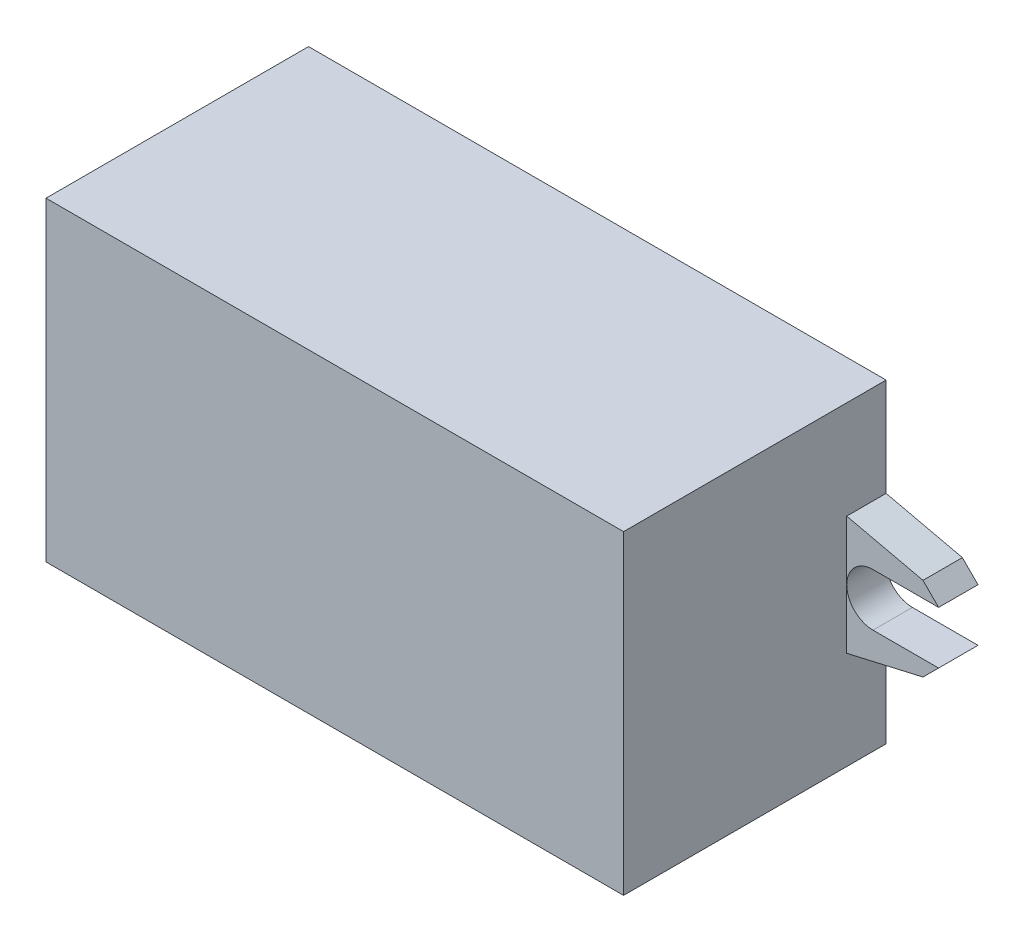
ISO-10303-21;
HEADER;
FILE_DESCRIPTION(('STEP AP214'),'2;1');
FILE_NAME('part.step','',(''),(''),'','','');
FILE_SCHEMA(('AUTOMOTIVE_DESIGN { 1 0 10303 214 1 1 1 1 }'));
ENDSEC;
DATA;
#1=APPLICATION_CONTEXT('core data for automotive mechanical design processes');
#2=APPLICATION_PROTOCOL_DEFINITION('international standard','automotive_design',2000,#1);
#3=PRODUCT_CONTEXT('',#1,'mechanical');
#4=PRODUCT('Part','Part','',(#3));
#5=PRODUCT_RELATED_PRODUCT_CATEGORY('part','',(#4));
#6=PRODUCT_DEFINITION_FORMATION('','',#4);
#7=PRODUCT_DEFINITION_CONTEXT('part definition',#1,'design');
#8=PRODUCT_DEFINITION('design','',#6,#7);
#9=PRODUCT_DEFINITION_SHAPE('','',#8);
#10=(LENGTH_UNIT() NAMED_UNIT(*) SI_UNIT(.MILLI.,.METRE.));
#11=(NAMED_UNIT(*) PLANE_ANGLE_UNIT() SI_UNIT($,.RADIAN.));
#12=(NAMED_UNIT(*) SI_UNIT($,.STERADIAN.) SOLID_ANGLE_UNIT());
#13=UNCERTAINTY_MEASURE_WITH_UNIT(LENGTH_MEASURE(1.E-05),#10,'distance_accuracy_value','');
#14=(GEOMETRIC_REPRESENTATION_CONTEXT(3) GLOBAL_UNCERTAINTY_ASSIGNED_CONTEXT((#13)) GLOBAL_UNIT_ASSIGNED_CONTEXT((#10,
#11,#12)) REPRESENTATION_CONTEXT('',''));
#15=CARTESIAN_POINT('',(0.,0.,0.));
#16=DIRECTION('',(0.,0.,1.));
#17=DIRECTION('',(1.,0.,0.));
#18=AXIS2_PLACEMENT_3D('',#15,#16,#17);
#19=CARTESIAN_POINT('',(22.,-12.,20.));
#20=DIRECTION('',(-1.,0.,0.));
#21=DIRECTION('',(0.,-1.,0.));
#22=AXIS2_PLACEMENT_3D('',#19,#20,#21);
#23=PLANE('',#22);
#24=DIRECTION('',(0.,1.,0.));
#25=VECTOR('',#24,1.);
#26=CARTESIAN_POINT('',(22.,-12.,0.));
#27=LINE('',#26,#25);
#28=CARTESIAN_POINT('',(22.,-12.,0.));
#29=VERTEX_POINT('',#28);
#30=CARTESIAN_POINT('',(22.,-4.52363981943461,0.));
#31=VERTEX_POINT('',#30);
#32=EDGE_CURVE('E238',#29,#31,#27,.T.);
#33=ORIENTED_EDGE('',*,*,#32,.T.);
#34=DIRECTION('',(0.,0.,-1.));
#35=VECTOR('',#34,1.);
#36=CARTESIAN_POINT('',(22.,-4.52363981943461,3.));
#37=LINE('',#36,#35);
#38=CARTESIAN_POINT('',(22.,-4.52363981943461,3.));
#39=VERTEX_POINT('',#38);
#40=EDGE_CURVE('E222',#39,#31,#37,.T.);
#41=ORIENTED_EDGE('',*,*,#40,.F.);
#42=DIRECTION('',(0.,-1.,0.));
#43=VECTOR('',#42,1.);
#44=CARTESIAN_POINT('',(22.,0.,3.));
#45=LINE('',#44,#43);
#46=CARTESIAN_POINT('',(22.,0.,3.));
#47=VERTEX_POINT('',#46);
#48=EDGE_CURVE('E474',#47,#39,#45,.T.);
#49=ORIENTED_EDGE('',*,*,#48,.F.);
#50=DIRECTION('',(0.,-1.,0.));
#51=VECTOR('',#50,1.);
#52=CARTESIAN_POINT('',(22.,0.,3.));
#53=LINE('',#52,#51);
#54=CARTESIAN_POINT('',(22.,4.52363981943461,3.));
#55=VERTEX_POINT('',#54);
#56=EDGE_CURVE('E91',#55,#47,#53,.T.);
#57=ORIENTED_EDGE('',*,*,#56,.F.);
#58=DIRECTION('',(0.,0.,-1.));
#59=VECTOR('',#58,1.);
#60=CARTESIAN_POINT('',(22.,4.52363981943461,3.));
#61=LINE('',#60,#59);
#62=CARTESIAN_POINT('',(22.,4.52363981943461,0.));
#63=VERTEX_POINT('',#62);
#64=EDGE_CURVE('E430',#55,#63,#61,.T.);
#65=ORIENTED_EDGE('',*,*,#64,.T.);
#66=CARTESIAN_POINT('',(22.,12.,0.));
#67=VERTEX_POINT('',#66);
#68=EDGE_CURVE('E250',#63,#67,#27,.T.);
#69=ORIENTED_EDGE('',*,*,#68,.T.);
#70=DIRECTION('',(0.,0.,-1.));
#71=VECTOR('',#70,1.);
#72=CARTESIAN_POINT('',(22.,12.,20.));
#73=LINE('',#72,#71);
#74=CARTESIAN_POINT('',(22.,12.,20.));
#75=VERTEX_POINT('',#74);
#76=EDGE_CURVE('E264',#75,#67,#73,.T.);
#77=ORIENTED_EDGE('',*,*,#76,.F.);
#78=DIRECTION('',(0.,1.,0.));
#79=VECTOR('',#78,1.);
#80=CARTESIAN_POINT('',(22.,-12.,20.));
#81=LINE('',#80,#79);
#82=CARTESIAN_POINT('',(22.,-12.,20.));
#83=VERTEX_POINT('',#82);
#84=EDGE_CURVE('E271',#83,#75,#81,.T.);
#85=ORIENTED_EDGE('',*,*,#84,.F.);
#86=DIRECTION('',(0.,0.,-1.));
#87=VECTOR('',#86,1.);
#88=CARTESIAN_POINT('',(22.,-12.,20.));
#89=LINE('',#88,#87);
#90=EDGE_CURVE('E84',#83,#29,#89,.T.);
#91=ORIENTED_EDGE('',*,*,#90,.T.);
#92=EDGE_LOOP('',(#33,#41,#49,#57,#65,#69,#77,#85,#91));
#93=FACE_BOUND('',#92,.T.);
#94=ADVANCED_FACE('F75',(#93),#23,.F.);
#95=CARTESIAN_POINT('',(-22.,-12.,20.));
#96=DIRECTION('',(1.,0.,0.));
#97=DIRECTION('',(0.,0.,-1.));
#98=AXIS2_PLACEMENT_3D('',#95,#96,#97);
#99=PLANE('',#98);
#100=DIRECTION('',(0.,0.,-1.));
#101=VECTOR('',#100,1.);
#102=CARTESIAN_POINT('',(-22.,-4.52363981943462,3.));
#103=LINE('',#102,#101);
#104=CARTESIAN_POINT('',(-22.,-4.52363981943462,3.));
#105=VERTEX_POINT('',#104);
#106=CARTESIAN_POINT('',(-22.,-4.52363981943462,0.));
#107=VERTEX_POINT('',#106);
#108=EDGE_CURVE('E393',#105,#107,#103,.T.);
#109=ORIENTED_EDGE('',*,*,#108,.T.);
#110=DIRECTION('',(0.,-1.,0.));
#111=VECTOR('',#110,1.);
#112=CARTESIAN_POINT('',(-22.,-12.,0.));
#113=LINE('',#112,#111);
#114=CARTESIAN_POINT('',(-22.,-12.,0.));
#115=VERTEX_POINT('',#114);
#116=EDGE_CURVE('E288',#107,#115,#113,.T.);
#117=ORIENTED_EDGE('',*,*,#116,.T.);
#118=DIRECTION('',(0.,0.,-1.));
#119=VECTOR('',#118,1.);
#120=CARTESIAN_POINT('',(-22.,-12.,20.));
#121=LINE('',#120,#119);
#122=CARTESIAN_POINT('',(-22.,-12.,20.));
#123=VERTEX_POINT('',#122);
#124=EDGE_CURVE('E12',#123,#115,#121,.T.);
#125=ORIENTED_EDGE('',*,*,#124,.F.);
#126=DIRECTION('',(0.,-1.,0.));
#127=VECTOR('',#126,1.);
#128=CARTESIAN_POINT('',(-22.,-12.,20.));
#129=LINE('',#128,#127);
#130=CARTESIAN_POINT('',(-22.,12.,20.));
#131=VERTEX_POINT('',#130);
#132=EDGE_CURVE('E254',#131,#123,#129,.T.);
#133=ORIENTED_EDGE('',*,*,#132,.F.);
#134=DIRECTION('',(0.,0.,-1.));
#135=VECTOR('',#134,1.);
#136=CARTESIAN_POINT('',(-22.,12.,20.));
#137=LINE('',#136,#135);
#138=CARTESIAN_POINT('',(-22.,12.,0.));
#139=VERTEX_POINT('',#138);
#140=EDGE_CURVE('E260',#131,#139,#137,.T.);
#141=ORIENTED_EDGE('',*,*,#140,.T.);
#142=CARTESIAN_POINT('',(-22.,4.52363981943461,0.));
#143=VERTEX_POINT('',#142);
#144=EDGE_CURVE('E286',#139,#143,#113,.T.);
#145=ORIENTED_EDGE('',*,*,#144,.T.);
#146=DIRECTION('',(0.,0.,-1.));
#147=VECTOR('',#146,1.);
#148=CARTESIAN_POINT('',(-22.,4.52363981943461,3.));
#149=LINE('',#148,#147);
#150=CARTESIAN_POINT('',(-22.,4.52363981943461,3.));
#151=VERTEX_POINT('',#150);
#152=EDGE_CURVE('E292',#151,#143,#149,.T.);
#153=ORIENTED_EDGE('',*,*,#152,.F.);
#154=DIRECTION('',(0.,1.,0.));
#155=VECTOR('',#154,1.);
#156=CARTESIAN_POINT('',(-22.,0.,3.));
#157=LINE('',#156,#155);
#158=CARTESIAN_POINT('',(-22.,0.,3.));
#159=VERTEX_POINT('',#158);
#160=EDGE_CURVE('E313',#159,#151,#157,.T.);
#161=ORIENTED_EDGE('',*,*,#160,.F.);
#162=DIRECTION('',(0.,1.,0.));
#163=VECTOR('',#162,1.);
#164=CARTESIAN_POINT('',(-22.,0.,3.));
#165=LINE('',#164,#163);
#166=EDGE_CURVE('E99',#105,#159,#165,.T.);
#167=ORIENTED_EDGE('',*,*,#166,.F.);
#168=EDGE_LOOP('',(#109,#117,#125,#133,#141,#145,#153,#161,#167));
#169=FACE_BOUND('',#168,.T.);
#170=ADVANCED_FACE('F77',(#169),#99,.F.);
#171=CARTESIAN_POINT('',(22.,-12.,20.));
#172=DIRECTION('',(0.,1.,0.));
#173=DIRECTION('',(-1.,0.,0.));
#174=AXIS2_PLACEMENT_3D('',#171,#172,#173);
#175=PLANE('',#174);
#176=DIRECTION('',(1.,0.,0.));
#177=VECTOR('',#176,1.);
#178=CARTESIAN_POINT('',(22.,-12.,0.));
#179=LINE('',#178,#177);
#180=EDGE_CURVE('E256',#115,#29,#179,.T.);
#181=ORIENTED_EDGE('',*,*,#180,.T.);
#182=ORIENTED_EDGE('',*,*,#90,.F.);
#183=DIRECTION('',(1.,0.,0.));
#184=VECTOR('',#183,1.);
#185=CARTESIAN_POINT('',(22.,-12.,20.));
#186=LINE('',#185,#184);
#187=EDGE_CURVE('E274',#123,#83,#186,.T.);
#188=ORIENTED_EDGE('',*,*,#187,.F.);
#189=ORIENTED_EDGE('',*,*,#124,.T.);
#190=EDGE_LOOP('',(#181,#182,#188,#189));
#191=FACE_BOUND('',#190,.T.);
#192=ADVANCED_FACE('F373',(#191),#175,.F.);
#193=CARTESIAN_POINT('',(22.,12.,20.));
#194=DIRECTION('',(0.,-1.,0.));
#195=DIRECTION('',(1.,0.,0.));
#196=AXIS2_PLACEMENT_3D('',#193,#194,#195);
#197=PLANE('',#196);
#198=DIRECTION('',(-1.,0.,0.));
#199=VECTOR('',#198,1.);
#200=CARTESIAN_POINT('',(22.,12.,0.));
#201=LINE('',#200,#199);
#202=EDGE_CURVE('E249',#67,#139,#201,.T.);
#203=ORIENTED_EDGE('',*,*,#202,.T.);
#204=ORIENTED_EDGE('',*,*,#140,.F.);
#205=DIRECTION('',(-1.,0.,0.));
#206=VECTOR('',#205,1.);
#207=CARTESIAN_POINT('',(22.,12.,20.));
#208=LINE('',#207,#206);
#209=EDGE_CURVE('E265',#75,#131,#208,.T.);
#210=ORIENTED_EDGE('',*,*,#209,.F.);
#211=ORIENTED_EDGE('',*,*,#76,.T.);
#212=EDGE_LOOP('',(#203,#204,#210,#211));
#213=FACE_BOUND('',#212,.T.);
#214=ADVANCED_FACE('F375',(#213),#197,.F.);
#215=CARTESIAN_POINT('',(0.,0.,20.));
#216=DIRECTION('',(0.,0.,1.));
#217=DIRECTION('',(1.,0.,0.));
#218=AXIS2_PLACEMENT_3D('',#215,#216,#217);
#219=PLANE('',#218);
#220=ORIENTED_EDGE('',*,*,#132,.T.);
#221=ORIENTED_EDGE('',*,*,#187,.T.);
#222=ORIENTED_EDGE('',*,*,#84,.T.);
#223=ORIENTED_EDGE('',*,*,#209,.T.);
#224=EDGE_LOOP('',(#220,#221,#222,#223));
#225=FACE_BOUND('',#224,.T.);
#226=ADVANCED_FACE('F382',(#225),#219,.T.);
#227=CARTESIAN_POINT('',(0.,0.,0.));
#228=DIRECTION('',(0.,0.,1.));
#229=DIRECTION('',(1.,0.,0.));
#230=AXIS2_PLACEMENT_3D('',#227,#228,#229);
#231=PLANE('',#230);
#232=ORIENTED_EDGE('',*,*,#144,.F.);
#233=ORIENTED_EDGE('',*,*,#202,.F.);
#234=ORIENTED_EDGE('',*,*,#68,.F.);
#235=DIRECTION('',(-0.974674445375651,0.223628543642503,0.));
#236=VECTOR('',#235,1.);
#237=CARTESIAN_POINT('',(2.08620923592413,9.09264442204883,0.));
#238=LINE('',#237,#236);
#239=CARTESIAN_POINT('',(27.8092239984613,3.19077600153869,0.));
#240=VERTEX_POINT('',#239);
#241=EDGE_CURVE('E451',#240,#63,#238,.T.);
#242=ORIENTED_EDGE('',*,*,#241,.F.);
#243=DIRECTION('',(-0.707106781186546,0.707106781186549,0.));
#244=VECTOR('',#243,1.);
#245=CARTESIAN_POINT('',(15.5000000000001,15.5,0.));
#246=LINE('',#245,#244);
#247=CARTESIAN_POINT('',(29.,1.99999999999999,0.));
#248=VERTEX_POINT('',#247);
#249=EDGE_CURVE('E448',#248,#240,#246,.T.);
#250=ORIENTED_EDGE('',*,*,#249,.F.);
#251=DIRECTION('',(-1.,0.,0.));
#252=VECTOR('',#251,1.);
#253=CARTESIAN_POINT('',(0.,2.,0.));
#254=LINE('',#253,#252);
#255=CARTESIAN_POINT('',(24.,1.99999999999999,0.));
#256=VERTEX_POINT('',#255);
#257=EDGE_CURVE('E443',#248,#256,#254,.T.);
#258=ORIENTED_EDGE('',*,*,#257,.T.);
#259=CARTESIAN_POINT('',(24.,0.,0.));
#260=DIRECTION('',(0.,0.,-1.));
#261=DIRECTION('',(-1.,0.,0.));
#262=AXIS2_PLACEMENT_3D('',#259,#260,#261);
#263=CIRCLE('',#262,2.);
#264=CARTESIAN_POINT('',(24.,-2.,0.));
#265=VERTEX_POINT('',#264);
#266=EDGE_CURVE('E243',#265,#256,#263,.T.);
#267=ORIENTED_EDGE('',*,*,#266,.F.);
#268=DIRECTION('',(-1.,0.,0.));
#269=VECTOR('',#268,1.);
#270=CARTESIAN_POINT('',(0.,-1.99999999999999,0.));
#271=LINE('',#270,#269);
#272=CARTESIAN_POINT('',(29.,-2.00000000000001,0.));
#273=VERTEX_POINT('',#272);
#274=EDGE_CURVE('E488',#273,#265,#271,.T.);
#275=ORIENTED_EDGE('',*,*,#274,.F.);
#276=DIRECTION('',(-0.707106781186546,-0.707106781186549,0.));
#277=VECTOR('',#276,1.);
#278=CARTESIAN_POINT('',(15.5,-15.5,0.));
#279=LINE('',#278,#277);
#280=CARTESIAN_POINT('',(27.8092239984613,-3.1907760015387,0.));
#281=VERTEX_POINT('',#280);
#282=EDGE_CURVE('E241',#273,#281,#279,.T.);
#283=ORIENTED_EDGE('',*,*,#282,.T.);
#284=DIRECTION('',(-0.974674445375651,-0.223628543642503,0.));
#285=VECTOR('',#284,1.);
#286=CARTESIAN_POINT('',(2.08620923592412,-9.09264442204883,0.));
#287=LINE('',#286,#285);
#288=EDGE_CURVE('E225',#281,#31,#287,.T.);
#289=ORIENTED_EDGE('',*,*,#288,.T.);
#290=ORIENTED_EDGE('',*,*,#32,.F.);
#291=ORIENTED_EDGE('',*,*,#180,.F.);
#292=ORIENTED_EDGE('',*,*,#116,.F.);
#293=DIRECTION('',(0.974674445375651,-0.223628543642503,0.));
#294=VECTOR('',#293,1.);
#295=CARTESIAN_POINT('',(-2.08620923592412,-9.09264442204883,0.));
#296=LINE('',#295,#294);
#297=CARTESIAN_POINT('',(-27.8092239984613,-3.1907760015387,0.));
#298=VERTEX_POINT('',#297);
#299=EDGE_CURVE('E387',#298,#107,#296,.T.);
#300=ORIENTED_EDGE('',*,*,#299,.F.);
#301=DIRECTION('',(0.707106781186546,-0.707106781186549,0.));
#302=VECTOR('',#301,1.);
#303=CARTESIAN_POINT('',(-15.5,-15.5,0.));
#304=LINE('',#303,#302);
#305=CARTESIAN_POINT('',(-29.,-2.00000000000001,0.));
#306=VERTEX_POINT('',#305);
#307=EDGE_CURVE('E402',#306,#298,#304,.T.);
#308=ORIENTED_EDGE('',*,*,#307,.F.);
#309=DIRECTION('',(1.,0.,0.));
#310=VECTOR('',#309,1.);
#311=CARTESIAN_POINT('',(0.,-1.99999999999999,0.));
#312=LINE('',#311,#310);
#313=CARTESIAN_POINT('',(-24.,-2.,0.));
#314=VERTEX_POINT('',#313);
#315=EDGE_CURVE('E334',#306,#314,#312,.T.);
#316=ORIENTED_EDGE('',*,*,#315,.T.);
#317=CARTESIAN_POINT('',(-24.,0.,0.));
#318=DIRECTION('',(0.,0.,-1.));
#319=DIRECTION('',(-1.,0.,0.));
#320=AXIS2_PLACEMENT_3D('',#317,#318,#319);
#321=CIRCLE('',#320,2.);
#322=CARTESIAN_POINT('',(-24.,1.99999999999999,0.));
#323=VERTEX_POINT('',#322);
#324=EDGE_CURVE('E330',#323,#314,#321,.T.);
#325=ORIENTED_EDGE('',*,*,#324,.F.);
#326=DIRECTION('',(1.,0.,0.));
#327=VECTOR('',#326,1.);
#328=CARTESIAN_POINT('',(0.,2.,0.));
#329=LINE('',#328,#327);
#330=CARTESIAN_POINT('',(-29.,1.99999999999999,0.));
#331=VERTEX_POINT('',#330);
#332=EDGE_CURVE('E333',#331,#323,#329,.T.);
#333=ORIENTED_EDGE('',*,*,#332,.F.);
#334=DIRECTION('',(0.707106781186546,0.707106781186549,0.));
#335=VECTOR('',#334,1.);
#336=CARTESIAN_POINT('',(-15.5000000000001,15.5,0.));
#337=LINE('',#336,#335);
#338=CARTESIAN_POINT('',(-27.8092239984613,3.19077600153868,0.));
#339=VERTEX_POINT('',#338);
#340=EDGE_CURVE('E336',#331,#339,#337,.T.);
#341=ORIENTED_EDGE('',*,*,#340,.T.);
#342=DIRECTION('',(0.974674445375651,0.223628543642503,0.));
#343=VECTOR('',#342,1.);
#344=CARTESIAN_POINT('',(-2.08620923592413,9.09264442204884,0.));
#345=LINE('',#344,#343);
#346=EDGE_CURVE('E305',#339,#143,#345,.T.);
#347=ORIENTED_EDGE('',*,*,#346,.T.);
#348=EDGE_LOOP('',(#232,#233,#234,#242,#250,#258,#267,#275,#283,#289,#290,#291,#292,#300,#308,
#316,#325,#333,#341,#347));
#349=FACE_BOUND('',#348,.T.);
#350=ADVANCED_FACE('F236',(#349),#231,.F.);
#351=CARTESIAN_POINT('',(-24.,0.,3.));
#352=DIRECTION('',(0.,0.,-1.));
#353=DIRECTION('',(-1.,0.,0.));
#354=AXIS2_PLACEMENT_3D('',#351,#352,#353);
#355=CYLINDRICAL_SURFACE('',#354,2.);
#356=ORIENTED_EDGE('',*,*,#324,.T.);
#357=DIRECTION('',(0.,0.,-1.));
#358=VECTOR('',#357,1.);
#359=CARTESIAN_POINT('',(-24.,-2.,3.));
#360=LINE('',#359,#358);
#361=CARTESIAN_POINT('',(-24.,-2.,3.));
#362=VERTEX_POINT('',#361);
#363=EDGE_CURVE('E411',#362,#314,#360,.T.);
#364=ORIENTED_EDGE('',*,*,#363,.F.);
#365=CARTESIAN_POINT('',(-24.,0.,3.));
#366=DIRECTION('',(0.,0.,-1.));
#367=DIRECTION('',(-1.,0.,0.));
#368=AXIS2_PLACEMENT_3D('',#365,#366,#367);
#369=CIRCLE('',#368,2.);
#370=EDGE_CURVE('E348',#159,#362,#369,.T.);
#371=ORIENTED_EDGE('',*,*,#370,.F.);
#372=CARTESIAN_POINT('',(-24.,0.,3.));
#373=DIRECTION('',(0.,0.,-1.));
#374=DIRECTION('',(-1.,0.,0.));
#375=AXIS2_PLACEMENT_3D('',#372,#373,#374);
#376=CIRCLE('',#375,2.);
#377=CARTESIAN_POINT('',(-24.,1.99999999999999,3.));
#378=VERTEX_POINT('',#377);
#379=EDGE_CURVE('E341',#378,#159,#376,.T.);
#380=ORIENTED_EDGE('',*,*,#379,.F.);
#381=DIRECTION('',(0.,0.,-1.));
#382=VECTOR('',#381,1.);
#383=CARTESIAN_POINT('',(-24.,1.99999999999999,3.));
#384=LINE('',#383,#382);
#385=EDGE_CURVE('E284',#378,#323,#384,.T.);
#386=ORIENTED_EDGE('',*,*,#385,.T.);
#387=EDGE_LOOP('',(#356,#364,#371,#380,#386));
#388=FACE_BOUND('',#387,.T.);
#389=ADVANCED_FACE('F358',(#388),#355,.F.);
#390=CARTESIAN_POINT('',(-2.08620923592413,9.09264442204884,3.));
#391=DIRECTION('',(-0.223628543642503,0.974674445375651,0.));
#392=DIRECTION('',(-0.974674445375651,-0.223628543642503,0.));
#393=AXIS2_PLACEMENT_3D('',#390,#391,#392);
#394=PLANE('',#393);
#395=ORIENTED_EDGE('',*,*,#346,.F.);
#396=DIRECTION('',(0.,0.,-1.));
#397=VECTOR('',#396,1.);
#398=CARTESIAN_POINT('',(-27.8092239984613,3.19077600153868,3.));
#399=LINE('',#398,#397);
#400=CARTESIAN_POINT('',(-27.8092239984613,3.19077600153868,3.));
#401=VERTEX_POINT('',#400);
#402=EDGE_CURVE('E295',#401,#339,#399,.T.);
#403=ORIENTED_EDGE('',*,*,#402,.F.);
#404=DIRECTION('',(0.974674445375651,0.223628543642503,0.));
#405=VECTOR('',#404,1.);
#406=CARTESIAN_POINT('',(-2.08620923592413,9.09264442204884,3.));
#407=LINE('',#406,#405);
#408=EDGE_CURVE('E320',#401,#151,#407,.T.);
#409=ORIENTED_EDGE('',*,*,#408,.T.);
#410=ORIENTED_EDGE('',*,*,#152,.T.);
#411=EDGE_LOOP('',(#395,#403,#409,#410));
#412=FACE_BOUND('',#411,.T.);
#413=ADVANCED_FACE('F356',(#412),#394,.T.);
#414=CARTESIAN_POINT('',(-15.5000000000001,15.5,3.));
#415=DIRECTION('',(-0.707106781186549,0.707106781186546,0.));
#416=DIRECTION('',(-0.707106781186546,-0.707106781186549,0.));
#417=AXIS2_PLACEMENT_3D('',#414,#415,#416);
#418=PLANE('',#417);
#419=ORIENTED_EDGE('',*,*,#340,.F.);
#420=DIRECTION('',(0.,0.,-1.));
#421=VECTOR('',#420,1.);
#422=CARTESIAN_POINT('',(-29.,1.99999999999999,3.));
#423=LINE('',#422,#421);
#424=CARTESIAN_POINT('',(-29.,1.99999999999999,3.));
#425=VERTEX_POINT('',#424);
#426=EDGE_CURVE('E302',#425,#331,#423,.T.);
#427=ORIENTED_EDGE('',*,*,#426,.F.);
#428=DIRECTION('',(0.707106781186546,0.707106781186549,0.));
#429=VECTOR('',#428,1.);
#430=CARTESIAN_POINT('',(-15.5000000000001,15.5,3.));
#431=LINE('',#430,#429);
#432=EDGE_CURVE('E326',#425,#401,#431,.T.);
#433=ORIENTED_EDGE('',*,*,#432,.T.);
#434=ORIENTED_EDGE('',*,*,#402,.T.);
#435=EDGE_LOOP('',(#419,#427,#433,#434));
#436=FACE_BOUND('',#435,.T.);
#437=ADVANCED_FACE('F354',(#436),#418,.T.);
#438=CARTESIAN_POINT('',(0.,2.,3.));
#439=DIRECTION('',(0.,1.,0.));
#440=DIRECTION('',(-1.,0.,0.));
#441=AXIS2_PLACEMENT_3D('',#438,#439,#440);
#442=PLANE('',#441);
#443=ORIENTED_EDGE('',*,*,#332,.T.);
#444=ORIENTED_EDGE('',*,*,#385,.F.);
#445=DIRECTION('',(1.,0.,0.));
#446=VECTOR('',#445,1.);
#447=CARTESIAN_POINT('',(0.,2.,3.));
#448=LINE('',#447,#446);
#449=EDGE_CURVE('E343',#425,#378,#448,.T.);
#450=ORIENTED_EDGE('',*,*,#449,.F.);
#451=ORIENTED_EDGE('',*,*,#426,.T.);
#452=EDGE_LOOP('',(#443,#444,#450,#451));
#453=FACE_BOUND('',#452,.T.);
#454=ADVANCED_FACE('F364',(#453),#442,.F.);
#455=CARTESIAN_POINT('',(0.,0.,3.));
#456=DIRECTION('',(0.,0.,-1.));
#457=DIRECTION('',(-1.,0.,0.));
#458=AXIS2_PLACEMENT_3D('',#455,#456,#457);
#459=PLANE('',#458);
#460=ORIENTED_EDGE('',*,*,#379,.T.);
#461=ORIENTED_EDGE('',*,*,#160,.T.);
#462=ORIENTED_EDGE('',*,*,#408,.F.);
#463=ORIENTED_EDGE('',*,*,#432,.F.);
#464=ORIENTED_EDGE('',*,*,#449,.T.);
#465=EDGE_LOOP('',(#460,#461,#462,#463,#464));
#466=FACE_BOUND('',#465,.T.);
#467=ADVANCED_FACE('F355',(#466),#459,.F.);
#468=CARTESIAN_POINT('',(0.,-1.99999999999999,3.));
#469=DIRECTION('',(0.,1.,0.));
#470=DIRECTION('',(-1.,0.,0.));
#471=AXIS2_PLACEMENT_3D('',#468,#469,#470);
#472=PLANE('',#471);
#473=ORIENTED_EDGE('',*,*,#315,.F.);
#474=DIRECTION('',(0.,0.,-1.));
#475=VECTOR('',#474,1.);
#476=CARTESIAN_POINT('',(-29.,-2.00000000000001,3.));
#477=LINE('',#476,#475);
#478=CARTESIAN_POINT('',(-29.,-2.00000000000001,3.));
#479=VERTEX_POINT('',#478);
#480=EDGE_CURVE('E397',#479,#306,#477,.T.);
#481=ORIENTED_EDGE('',*,*,#480,.F.);
#482=DIRECTION('',(1.,0.,0.));
#483=VECTOR('',#482,1.);
#484=CARTESIAN_POINT('',(0.,-1.99999999999999,3.));
#485=LINE('',#484,#483);
#486=EDGE_CURVE('E407',#479,#362,#485,.T.);
#487=ORIENTED_EDGE('',*,*,#486,.T.);
#488=ORIENTED_EDGE('',*,*,#363,.T.);
#489=EDGE_LOOP('',(#473,#481,#487,#488));
#490=FACE_BOUND('',#489,.T.);
#491=ADVANCED_FACE('F544',(#490),#472,.T.);
#492=CARTESIAN_POINT('',(-15.5,-15.5,3.));
#493=DIRECTION('',(0.707106781186549,0.707106781186546,0.));
#494=DIRECTION('',(-0.707106781186546,0.707106781186549,0.));
#495=AXIS2_PLACEMENT_3D('',#492,#493,#494);
#496=PLANE('',#495);
#497=ORIENTED_EDGE('',*,*,#307,.T.);
#498=DIRECTION('',(0.,0.,-1.));
#499=VECTOR('',#498,1.);
#500=CARTESIAN_POINT('',(-27.8092239984613,-3.1907760015387,3.));
#501=LINE('',#500,#499);
#502=CARTESIAN_POINT('',(-27.8092239984613,-3.1907760015387,3.));
#503=VERTEX_POINT('',#502);
#504=EDGE_CURVE('E395',#503,#298,#501,.T.);
#505=ORIENTED_EDGE('',*,*,#504,.F.);
#506=DIRECTION('',(0.707106781186546,-0.707106781186549,0.));
#507=VECTOR('',#506,1.);
#508=CARTESIAN_POINT('',(-15.5,-15.5,3.));
#509=LINE('',#508,#507);
#510=EDGE_CURVE('E413',#479,#503,#509,.T.);
#511=ORIENTED_EDGE('',*,*,#510,.F.);
#512=ORIENTED_EDGE('',*,*,#480,.T.);
#513=EDGE_LOOP('',(#497,#505,#511,#512));
#514=FACE_BOUND('',#513,.T.);
#515=ADVANCED_FACE('F552',(#514),#496,.F.);
#516=CARTESIAN_POINT('',(-2.08620923592412,-9.09264442204883,3.));
#517=DIRECTION('',(0.223628543642503,0.974674445375651,0.));
#518=DIRECTION('',(-0.974674445375651,0.223628543642503,0.));
#519=AXIS2_PLACEMENT_3D('',#516,#517,#518);
#520=PLANE('',#519);
#521=ORIENTED_EDGE('',*,*,#299,.T.);
#522=ORIENTED_EDGE('',*,*,#108,.F.);
#523=DIRECTION('',(0.974674445375651,-0.223628543642503,0.));
#524=VECTOR('',#523,1.);
#525=CARTESIAN_POINT('',(-2.08620923592412,-9.09264442204883,3.));
#526=LINE('',#525,#524);
#527=EDGE_CURVE('E416',#503,#105,#526,.T.);
#528=ORIENTED_EDGE('',*,*,#527,.F.);
#529=ORIENTED_EDGE('',*,*,#504,.T.);
#530=EDGE_LOOP('',(#521,#522,#528,#529));
#531=FACE_BOUND('',#530,.T.);
#532=ADVANCED_FACE('F391',(#531),#520,.F.);
#533=CARTESIAN_POINT('',(0.,0.,3.));
#534=DIRECTION('',(0.,0.,-1.));
#535=DIRECTION('',(-1.,0.,0.));
#536=AXIS2_PLACEMENT_3D('',#533,#534,#535);
#537=PLANE('',#536);
#538=ORIENTED_EDGE('',*,*,#370,.T.);
#539=ORIENTED_EDGE('',*,*,#486,.F.);
#540=ORIENTED_EDGE('',*,*,#510,.T.);
#541=ORIENTED_EDGE('',*,*,#527,.T.);
#542=ORIENTED_EDGE('',*,*,#166,.T.);
#543=EDGE_LOOP('',(#538,#539,#540,#541,#542));
#544=FACE_BOUND('',#543,.T.);
#545=ADVANCED_FACE('F549',(#544),#537,.F.);
#546=CARTESIAN_POINT('',(24.,0.,3.));
#547=DIRECTION('',(0.,0.,-1.));
#548=DIRECTION('',(-1.,0.,0.));
#549=AXIS2_PLACEMENT_3D('',#546,#547,#548);
#550=CYLINDRICAL_SURFACE('',#549,2.);
#551=ORIENTED_EDGE('',*,*,#266,.T.);
#552=DIRECTION('',(0.,0.,-1.));
#553=VECTOR('',#552,1.);
#554=CARTESIAN_POINT('',(24.,1.99999999999999,3.));
#555=LINE('',#554,#553);
#556=CARTESIAN_POINT('',(24.,1.99999999999999,3.));
#557=VERTEX_POINT('',#556);
#558=EDGE_CURVE('E412',#557,#256,#555,.T.);
#559=ORIENTED_EDGE('',*,*,#558,.F.);
#560=CARTESIAN_POINT('',(24.,0.,3.));
#561=DIRECTION('',(0.,0.,-1.));
#562=DIRECTION('',(-1.,0.,0.));
#563=AXIS2_PLACEMENT_3D('',#560,#561,#562);
#564=CIRCLE('',#563,2.);
#565=EDGE_CURVE('E447',#47,#557,#564,.T.);
#566=ORIENTED_EDGE('',*,*,#565,.F.);
#567=CARTESIAN_POINT('',(24.,0.,3.));
#568=DIRECTION('',(0.,0.,-1.));
#569=DIRECTION('',(-1.,0.,0.));
#570=AXIS2_PLACEMENT_3D('',#567,#568,#569);
#571=CIRCLE('',#570,2.);
#572=CARTESIAN_POINT('',(24.,-2.,3.));
#573=VERTEX_POINT('',#572);
#574=EDGE_CURVE('E471',#573,#47,#571,.T.);
#575=ORIENTED_EDGE('',*,*,#574,.F.);
#576=DIRECTION('',(0.,0.,-1.));
#577=VECTOR('',#576,1.);
#578=CARTESIAN_POINT('',(24.,-2.,3.));
#579=LINE('',#578,#577);
#580=EDGE_CURVE('E485',#573,#265,#579,.T.);
#581=ORIENTED_EDGE('',*,*,#580,.T.);
#582=EDGE_LOOP('',(#551,#559,#566,#575,#581));
#583=FACE_BOUND('',#582,.T.);
#584=ADVANCED_FACE('F503',(#583),#550,.F.);
#585=CARTESIAN_POINT('',(0.,2.,3.));
#586=DIRECTION('',(0.,-1.,0.));
#587=DIRECTION('',(1.,0.,0.));
#588=AXIS2_PLACEMENT_3D('',#585,#586,#587);
#589=PLANE('',#588);
#590=ORIENTED_EDGE('',*,*,#257,.F.);
#591=DIRECTION('',(0.,0.,-1.));
#592=VECTOR('',#591,1.);
#593=CARTESIAN_POINT('',(29.,1.99999999999999,3.));
#594=LINE('',#593,#592);
#595=CARTESIAN_POINT('',(29.,1.99999999999999,3.));
#596=VERTEX_POINT('',#595);
#597=EDGE_CURVE('E438',#596,#248,#594,.T.);
#598=ORIENTED_EDGE('',*,*,#597,.F.);
#599=DIRECTION('',(-1.,0.,0.));
#600=VECTOR('',#599,1.);
#601=CARTESIAN_POINT('',(0.,2.,3.));
#602=LINE('',#601,#600);
#603=EDGE_CURVE('E434',#596,#557,#602,.T.);
#604=ORIENTED_EDGE('',*,*,#603,.T.);
#605=ORIENTED_EDGE('',*,*,#558,.T.);
#606=EDGE_LOOP('',(#590,#598,#604,#605));
#607=FACE_BOUND('',#606,.T.);
#608=ADVANCED_FACE('F521',(#607),#589,.T.);
#609=CARTESIAN_POINT('',(15.5000000000001,15.5,3.));
#610=DIRECTION('',(-0.707106781186549,-0.707106781186546,0.));
#611=DIRECTION('',(0.707106781186546,-0.707106781186549,0.));
#612=AXIS2_PLACEMENT_3D('',#609,#610,#611);
#613=PLANE('',#612);
#614=ORIENTED_EDGE('',*,*,#249,.T.);
#615=DIRECTION('',(0.,0.,-1.));
#616=VECTOR('',#615,1.);
#617=CARTESIAN_POINT('',(27.8092239984613,3.19077600153869,3.));
#618=LINE('',#617,#616);
#619=CARTESIAN_POINT('',(27.8092239984613,3.19077600153869,3.));
#620=VERTEX_POINT('',#619);
#621=EDGE_CURVE('E433',#620,#240,#618,.T.);
#622=ORIENTED_EDGE('',*,*,#621,.F.);
#623=DIRECTION('',(-0.707106781186546,0.707106781186549,0.));
#624=VECTOR('',#623,1.);
#625=CARTESIAN_POINT('',(15.5000000000001,15.5,3.));
#626=LINE('',#625,#624);
#627=EDGE_CURVE('E461',#596,#620,#626,.T.);
#628=ORIENTED_EDGE('',*,*,#627,.F.);
#629=ORIENTED_EDGE('',*,*,#597,.T.);
#630=EDGE_LOOP('',(#614,#622,#628,#629));
#631=FACE_BOUND('',#630,.T.);
#632=ADVANCED_FACE('F525',(#631),#613,.F.);
#633=CARTESIAN_POINT('',(2.08620923592413,9.09264442204883,3.));
#634=DIRECTION('',(-0.223628543642503,-0.974674445375651,0.));
#635=DIRECTION('',(0.974674445375651,-0.223628543642503,0.));
#636=AXIS2_PLACEMENT_3D('',#633,#634,#635);
#637=PLANE('',#636);
#638=ORIENTED_EDGE('',*,*,#241,.T.);
#639=ORIENTED_EDGE('',*,*,#64,.F.);
#640=DIRECTION('',(-0.974674445375651,0.223628543642503,0.));
#641=VECTOR('',#640,1.);
#642=CARTESIAN_POINT('',(2.08620923592413,9.09264442204883,3.));
#643=LINE('',#642,#641);
#644=EDGE_CURVE('E464',#620,#55,#643,.T.);
#645=ORIENTED_EDGE('',*,*,#644,.F.);
#646=ORIENTED_EDGE('',*,*,#621,.T.);
#647=EDGE_LOOP('',(#638,#639,#645,#646));
#648=FACE_BOUND('',#647,.T.);
#649=ADVANCED_FACE('F529',(#648),#637,.F.);
#650=CARTESIAN_POINT('',(0.,0.,3.));
#651=DIRECTION('',(0.,0.,-1.));
#652=DIRECTION('',(-1.,0.,0.));
#653=AXIS2_PLACEMENT_3D('',#650,#651,#652);
#654=PLANE('',#653);
#655=ORIENTED_EDGE('',*,*,#565,.T.);
#656=ORIENTED_EDGE('',*,*,#603,.F.);
#657=ORIENTED_EDGE('',*,*,#627,.T.);
#658=ORIENTED_EDGE('',*,*,#644,.T.);
#659=ORIENTED_EDGE('',*,*,#56,.T.);
#660=EDGE_LOOP('',(#655,#656,#657,#658,#659));
#661=FACE_BOUND('',#660,.T.);
#662=ADVANCED_FACE('F515',(#661),#654,.F.);
#663=CARTESIAN_POINT('',(2.08620923592412,-9.09264442204883,3.));
#664=DIRECTION('',(0.223628543642503,-0.974674445375651,0.));
#665=DIRECTION('',(0.974674445375651,0.223628543642503,0.));
#666=AXIS2_PLACEMENT_3D('',#663,#664,#665);
#667=PLANE('',#666);
#668=ORIENTED_EDGE('',*,*,#288,.F.);
#669=DIRECTION('',(0.,0.,-1.));
#670=VECTOR('',#669,1.);
#671=CARTESIAN_POINT('',(27.8092239984613,-3.1907760015387,3.));
#672=LINE('',#671,#670);
#673=CARTESIAN_POINT('',(27.8092239984613,-3.1907760015387,3.));
#674=VERTEX_POINT('',#673);
#675=EDGE_CURVE('E482',#674,#281,#672,.T.);
#676=ORIENTED_EDGE('',*,*,#675,.F.);
#677=DIRECTION('',(-0.974674445375651,-0.223628543642503,0.));
#678=VECTOR('',#677,1.);
#679=CARTESIAN_POINT('',(2.08620923592412,-9.09264442204883,3.));
#680=LINE('',#679,#678);
#681=EDGE_CURVE('E228',#674,#39,#680,.T.);
#682=ORIENTED_EDGE('',*,*,#681,.T.);
#683=ORIENTED_EDGE('',*,*,#40,.T.);
#684=EDGE_LOOP('',(#668,#676,#682,#683));
#685=FACE_BOUND('',#684,.T.);
#686=ADVANCED_FACE('F224',(#685),#667,.T.);
#687=CARTESIAN_POINT('',(15.5,-15.5,3.));
#688=DIRECTION('',(0.707106781186549,-0.707106781186546,0.));
#689=DIRECTION('',(0.707106781186546,0.707106781186549,0.));
#690=AXIS2_PLACEMENT_3D('',#687,#688,#689);
#691=PLANE('',#690);
#692=ORIENTED_EDGE('',*,*,#282,.F.);
#693=DIRECTION('',(0.,0.,-1.));
#694=VECTOR('',#693,1.);
#695=CARTESIAN_POINT('',(29.,-2.00000000000001,3.));
#696=LINE('',#695,#694);
#697=CARTESIAN_POINT('',(29.,-2.00000000000001,3.));
#698=VERTEX_POINT('',#697);
#699=EDGE_CURVE('E475',#698,#273,#696,.T.);
#700=ORIENTED_EDGE('',*,*,#699,.F.);
#701=DIRECTION('',(-0.707106781186546,-0.707106781186549,0.));
#702=VECTOR('',#701,1.);
#703=CARTESIAN_POINT('',(15.5,-15.5,3.));
#704=LINE('',#703,#702);
#705=EDGE_CURVE('E231',#698,#674,#704,.T.);
#706=ORIENTED_EDGE('',*,*,#705,.T.);
#707=ORIENTED_EDGE('',*,*,#675,.T.);
#708=EDGE_LOOP('',(#692,#700,#706,#707));
#709=FACE_BOUND('',#708,.T.);
#710=ADVANCED_FACE('F511',(#709),#691,.T.);
#711=CARTESIAN_POINT('',(0.,-1.99999999999999,3.));
#712=DIRECTION('',(0.,-1.,0.));
#713=DIRECTION('',(1.,0.,0.));
#714=AXIS2_PLACEMENT_3D('',#711,#712,#713);
#715=PLANE('',#714);
#716=ORIENTED_EDGE('',*,*,#274,.T.);
#717=ORIENTED_EDGE('',*,*,#580,.F.);
#718=DIRECTION('',(-1.,0.,0.));
#719=VECTOR('',#718,1.);
#720=CARTESIAN_POINT('',(0.,-1.99999999999999,3.));
#721=LINE('',#720,#719);
#722=EDGE_CURVE('E476',#698,#573,#721,.T.);
#723=ORIENTED_EDGE('',*,*,#722,.F.);
#724=ORIENTED_EDGE('',*,*,#699,.T.);
#725=EDGE_LOOP('',(#716,#717,#723,#724));
#726=FACE_BOUND('',#725,.T.);
#727=ADVANCED_FACE('F508',(#726),#715,.F.);
#728=CARTESIAN_POINT('',(0.,0.,3.));
#729=DIRECTION('',(0.,0.,-1.));
#730=DIRECTION('',(-1.,0.,0.));
#731=AXIS2_PLACEMENT_3D('',#728,#729,#730);
#732=PLANE('',#731);
#733=ORIENTED_EDGE('',*,*,#574,.T.);
#734=ORIENTED_EDGE('',*,*,#48,.T.);
#735=ORIENTED_EDGE('',*,*,#681,.F.);
#736=ORIENTED_EDGE('',*,*,#705,.F.);
#737=ORIENTED_EDGE('',*,*,#722,.T.);
#738=EDGE_LOOP('',(#733,#734,#735,#736,#737));
#739=FACE_BOUND('',#738,.T.);
#740=ADVANCED_FACE('F513',(#739),#732,.F.);
#741=CLOSED_SHELL('',(#94,#170,#192,#214,#226,#350,#389,#413,#437,#454,#467,#491,#515,#532,#545,
#584,#608,#632,#649,#662,#686,#710,#727,#740));
#742=MANIFOLD_SOLID_BREP('B2',#741);
#743=ADVANCED_BREP_SHAPE_REPRESENTATION('',(#18,#742),#14);
#744=SHAPE_DEFINITION_REPRESENTATION(#9,#743);
ENDSEC;
END-ISO-10303-21;
